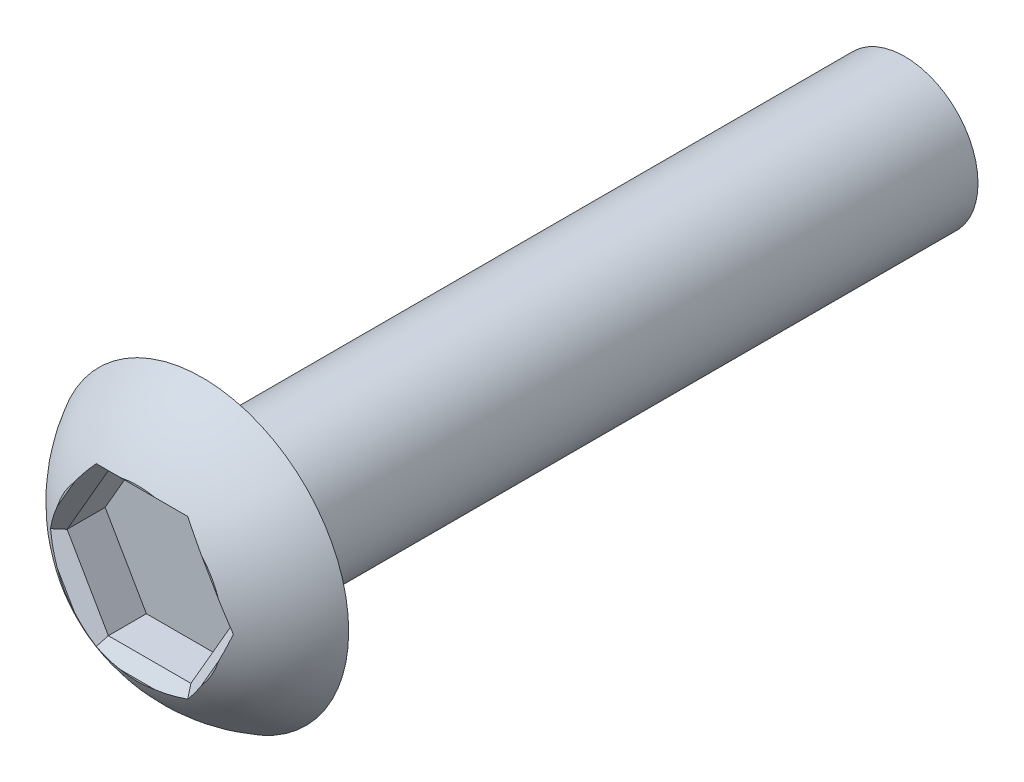
ISO-10303-21;
HEADER;
FILE_DESCRIPTION(('STEP AP214'),'2;1');
FILE_NAME('part.step','',(''),(''),'','','');
FILE_SCHEMA(('AUTOMOTIVE_DESIGN { 1 0 10303 214 1 1 1 1 }'));
ENDSEC;
DATA;
#1=APPLICATION_CONTEXT('core data for automotive mechanical design processes');
#2=APPLICATION_PROTOCOL_DEFINITION('international standard','automotive_design',2000,#1);
#3=PRODUCT_CONTEXT('',#1,'mechanical');
#4=PRODUCT('Part','Part','',(#3));
#5=PRODUCT_RELATED_PRODUCT_CATEGORY('part','',(#4));
#6=PRODUCT_DEFINITION_FORMATION('','',#4);
#7=PRODUCT_DEFINITION_CONTEXT('part definition',#1,'design');
#8=PRODUCT_DEFINITION('design','',#6,#7);
#9=PRODUCT_DEFINITION_SHAPE('','',#8);
#10=(LENGTH_UNIT() NAMED_UNIT(*) SI_UNIT(.MILLI.,.METRE.));
#11=(NAMED_UNIT(*) PLANE_ANGLE_UNIT() SI_UNIT($,.RADIAN.));
#12=(NAMED_UNIT(*) SI_UNIT($,.STERADIAN.) SOLID_ANGLE_UNIT());
#13=UNCERTAINTY_MEASURE_WITH_UNIT(LENGTH_MEASURE(1.E-05),#10,'distance_accuracy_value','');
#14=(GEOMETRIC_REPRESENTATION_CONTEXT(3) GLOBAL_UNCERTAINTY_ASSIGNED_CONTEXT((#13)) GLOBAL_UNIT_ASSIGNED_CONTEXT((#10,
#11,#12)) REPRESENTATION_CONTEXT('',''));
#15=CARTESIAN_POINT('',(0.,0.,0.));
#16=DIRECTION('',(0.,0.,1.));
#17=DIRECTION('',(1.,0.,0.));
#18=AXIS2_PLACEMENT_3D('',#15,#16,#17);
#19=CARTESIAN_POINT('',(-2.5,2.39752736076255,1.1));
#20=DIRECTION('',(0.,0.,-1.));
#21=DIRECTION('',(0.,1.,0.));
#22=AXIS2_PLACEMENT_3D('',#19,#20,#21);
#23=PLANE('',#22);
#24=CARTESIAN_POINT('',(0.,0.,1.1));
#25=DIRECTION('',(0.,0.,-1.));
#26=DIRECTION('',(0.,1.,0.));
#27=AXIS2_PLACEMENT_3D('',#24,#25,#26);
#28=CIRCLE('',#27,1.45143607047182);
#29=CARTESIAN_POINT('',(1.37844449970401,0.454485894063209,1.1));
#30=VERTEX_POINT('',#29);
#31=CARTESIAN_POINT('',(1.08281857977244,0.966525007418985,1.1));
#32=VERTEX_POINT('',#31);
#33=EDGE_CURVE('E298',#30,#32,#28,.F.);
#34=ORIENTED_EDGE('',*,*,#33,.T.);
#35=DIRECTION('',(0.499999999999995,-0.866025403784442,0.));
#36=VECTOR('',#35,1.);
#37=CARTESIAN_POINT('',(1.58310702606532,0.0999999999999997,1.1));
#38=LINE('',#37,#36);
#39=EDGE_CURVE('E216',#32,#30,#38,.T.);
#40=ORIENTED_EDGE('',*,*,#39,.T.);
#41=EDGE_LOOP('',(#34,#40));
#42=FACE_BOUND('',#41,.T.);
#43=ADVANCED_FACE('F43',(#42),#23,.F.);
#44=CARTESIAN_POINT('',(1.08281857977242,-0.966525007419008,1.1));
#45=VERTEX_POINT('',#44);
#46=CARTESIAN_POINT('',(1.37844449970401,-0.454485894063198,1.1));
#47=VERTEX_POINT('',#46);
#48=EDGE_CURVE('E305',#45,#47,#28,.F.);
#49=ORIENTED_EDGE('',*,*,#48,.T.);
#50=DIRECTION('',(-0.500000000000001,-0.866025403784438,0.));
#51=VECTOR('',#50,1.);
#52=CARTESIAN_POINT('',(0.878156053411103,-1.3210109014822,1.1));
#53=LINE('',#52,#51);
#54=EDGE_CURVE('E213',#47,#45,#53,.T.);
#55=ORIENTED_EDGE('',*,*,#54,.T.);
#56=EDGE_LOOP('',(#49,#55));
#57=FACE_BOUND('',#56,.T.);
#58=ADVANCED_FACE('F328',(#57),#23,.F.);
#59=CARTESIAN_POINT('',(-0.295625919931604,-1.4210109014822,1.1));
#60=VERTEX_POINT('',#59);
#61=CARTESIAN_POINT('',(0.295625919931595,-1.4210109014822,1.1));
#62=VERTEX_POINT('',#61);
#63=EDGE_CURVE('E314',#60,#62,#28,.F.);
#64=ORIENTED_EDGE('',*,*,#63,.T.);
#65=DIRECTION('',(-1.,0.,0.));
#66=VECTOR('',#65,1.);
#67=CARTESIAN_POINT('',(-0.704950972654223,-1.4210109014822,1.1));
#68=LINE('',#67,#66);
#69=EDGE_CURVE('E210',#62,#60,#68,.T.);
#70=ORIENTED_EDGE('',*,*,#69,.T.);
#71=EDGE_LOOP('',(#64,#70));
#72=FACE_BOUND('',#71,.T.);
#73=ADVANCED_FACE('F341',(#72),#23,.F.);
#74=CARTESIAN_POINT('',(-1.37844449970402,-0.454485894063183,1.1));
#75=VERTEX_POINT('',#74);
#76=CARTESIAN_POINT('',(-1.08281857977242,-0.966525007419005,1.1));
#77=VERTEX_POINT('',#76);
#78=EDGE_CURVE('E308',#75,#77,#28,.F.);
#79=ORIENTED_EDGE('',*,*,#78,.T.);
#80=DIRECTION('',(-0.499999999999995,0.866025403784442,0.));
#81=VECTOR('',#80,1.);
#82=CARTESIAN_POINT('',(-1.58310702606532,-0.0999999999999897,1.1));
#83=LINE('',#82,#81);
#84=EDGE_CURVE('E207',#77,#75,#83,.T.);
#85=ORIENTED_EDGE('',*,*,#84,.T.);
#86=EDGE_LOOP('',(#79,#85));
#87=FACE_BOUND('',#86,.T.);
#88=ADVANCED_FACE('F346',(#87),#23,.F.);
#89=CARTESIAN_POINT('',(0.295625919931614,1.4210109014822,1.1));
#90=VERTEX_POINT('',#89);
#91=CARTESIAN_POINT('',(-0.295625919931585,1.42101090148221,1.1));
#92=VERTEX_POINT('',#91);
#93=EDGE_CURVE('E292',#90,#92,#28,.F.);
#94=ORIENTED_EDGE('',*,*,#93,.T.);
#95=DIRECTION('',(1.,0.,0.));
#96=VECTOR('',#95,1.);
#97=CARTESIAN_POINT('',(0.704950972654233,1.42101090148219,1.1));
#98=LINE('',#97,#96);
#99=EDGE_CURVE('E204',#92,#90,#98,.T.);
#100=ORIENTED_EDGE('',*,*,#99,.T.);
#101=EDGE_LOOP('',(#94,#100));
#102=FACE_BOUND('',#101,.T.);
#103=ADVANCED_FACE('F356',(#102),#23,.F.);
#104=CARTESIAN_POINT('',(0.,0.,-1.33333333333333));
#105=DIRECTION('',(0.,0.,1.));
#106=DIRECTION('',(0.,-1.,0.));
#107=AXIS2_PLACEMENT_3D('',#104,#105,#106);
#108=SPHERICAL_SURFACE('',#107,2.83333333333333);
#109=ORIENTED_EDGE('',*,*,#33,.F.);
#110=CARTESIAN_POINT('',(-0.438348471401958,-0.253080607962778,-0.827172117407775));
#111=DIRECTION('',(-0.612372435695798,-0.353553390593271,0.707106781186546));
#112=DIRECTION('',(0.755928946018452,0.,0.65465367070798));
#113=AXIS2_PLACEMENT_3D('',#110,#111,#112);
#114=CIRCLE('',#113,2.74141923549889);
#115=CARTESIAN_POINT('',(1.56123159166266,0.,1.03105531808848));
#116=VERTEX_POINT('',#115);
#117=EDGE_CURVE('E253',#30,#116,#114,.F.);
#118=ORIENTED_EDGE('',*,*,#117,.T.);
#119=CARTESIAN_POINT('',(-0.438348471401959,0.253080607962783,-0.82717211740777));
#120=DIRECTION('',(-0.612372435695795,0.353553390593275,0.707106781186547));
#121=DIRECTION('',(0.755928946018454,0.,0.654653670707977));
#122=AXIS2_PLACEMENT_3D('',#119,#120,#121);
#123=CIRCLE('',#122,2.74141923549888);
#124=EDGE_CURVE('E250',#116,#47,#123,.F.);
#125=ORIENTED_EDGE('',*,*,#124,.T.);
#126=ORIENTED_EDGE('',*,*,#48,.F.);
#127=CARTESIAN_POINT('',(-0.438348471401959,0.253080607962783,-0.82717211740777));
#128=DIRECTION('',(-0.612372435695795,0.353553390593275,0.707106781186547));
#129=DIRECTION('',(0.755928946018454,0.,0.654653670707977));
#130=AXIS2_PLACEMENT_3D('',#127,#128,#129);
#131=CIRCLE('',#130,2.74141923549888);
#132=CARTESIAN_POINT('',(0.78061579583133,-1.35206621957068,1.03105531808848));
#133=VERTEX_POINT('',#132);
#134=EDGE_CURVE('E247',#45,#133,#131,.F.);
#135=ORIENTED_EDGE('',*,*,#134,.T.);
#136=CARTESIAN_POINT('',(0.,0.506161215925563,-0.827172117407775));
#137=DIRECTION('',(0.,0.707106781186549,0.707106781186546));
#138=DIRECTION('',(0.,-0.707106781186546,0.707106781186549));
#139=AXIS2_PLACEMENT_3D('',#136,#137,#138);
#140=CIRCLE('',#139,2.74141923549889);
#141=EDGE_CURVE('E244',#133,#62,#140,.F.);
#142=ORIENTED_EDGE('',*,*,#141,.T.);
#143=ORIENTED_EDGE('',*,*,#63,.F.);
#144=CARTESIAN_POINT('',(0.,0.506161215925563,-0.827172117407775));
#145=DIRECTION('',(0.,0.707106781186549,0.707106781186546));
#146=DIRECTION('',(0.,-0.707106781186546,0.707106781186549));
#147=AXIS2_PLACEMENT_3D('',#144,#145,#146);
#148=CIRCLE('',#147,2.74141923549889);
#149=CARTESIAN_POINT('',(-0.780615795831337,-1.35206621957068,1.03105531808848));
#150=VERTEX_POINT('',#149);
#151=EDGE_CURVE('E241',#60,#150,#148,.F.);
#152=ORIENTED_EDGE('',*,*,#151,.T.);
#153=CARTESIAN_POINT('',(0.43834847140196,0.253080607962779,-0.827172117407774));
#154=DIRECTION('',(0.612372435695798,0.353553390593271,0.707106781186546));
#155=DIRECTION('',(0.755928946018452,0.,-0.65465367070798));
#156=AXIS2_PLACEMENT_3D('',#153,#154,#155);
#157=CIRCLE('',#156,2.74141923549889);
#158=EDGE_CURVE('E238',#150,#77,#157,.F.);
#159=ORIENTED_EDGE('',*,*,#158,.T.);
#160=ORIENTED_EDGE('',*,*,#78,.F.);
#161=CARTESIAN_POINT('',(0.43834847140196,0.253080607962779,-0.827172117407774));
#162=DIRECTION('',(0.612372435695798,0.353553390593271,0.707106781186546));
#163=DIRECTION('',(0.755928946018452,0.,-0.65465367070798));
#164=AXIS2_PLACEMENT_3D('',#161,#162,#163);
#165=CIRCLE('',#164,2.74141923549889);
#166=CARTESIAN_POINT('',(-1.56123159166266,0.,1.03105531808848));
#167=VERTEX_POINT('',#166);
#168=EDGE_CURVE('E223',#75,#167,#165,.F.);
#169=ORIENTED_EDGE('',*,*,#168,.T.);
#170=CARTESIAN_POINT('',(0.438348471401956,-0.253080607962785,-0.827172117407773));
#171=DIRECTION('',(0.612372435695793,-0.353553390593279,0.707106781186546));
#172=DIRECTION('',(0.755928946018455,0.,-0.654653670707977));
#173=AXIS2_PLACEMENT_3D('',#170,#171,#172);
#174=CIRCLE('',#173,2.74141923549889);
#175=CARTESIAN_POINT('',(-1.37844449970401,0.454485894063204,1.1));
#176=VERTEX_POINT('',#175);
#177=EDGE_CURVE('E220',#167,#176,#174,.F.);
#178=ORIENTED_EDGE('',*,*,#177,.T.);
#179=CARTESIAN_POINT('',(-1.08281857977241,0.966525007419018,1.1));
#180=VERTEX_POINT('',#179);
#181=EDGE_CURVE('E176',#180,#176,#28,.F.);
#182=ORIENTED_EDGE('',*,*,#181,.F.);
#183=CARTESIAN_POINT('',(0.438348471401956,-0.253080607962785,-0.827172117407773));
#184=DIRECTION('',(0.612372435695793,-0.353553390593279,0.707106781186546));
#185=DIRECTION('',(0.755928946018455,0.,-0.654653670707977));
#186=AXIS2_PLACEMENT_3D('',#183,#184,#185);
#187=CIRCLE('',#186,2.74141923549889);
#188=CARTESIAN_POINT('',(-0.780615795831319,1.35206621957069,1.03105531808848));
#189=VERTEX_POINT('',#188);
#190=EDGE_CURVE('E226',#180,#189,#187,.F.);
#191=ORIENTED_EDGE('',*,*,#190,.T.);
#192=CARTESIAN_POINT('',(0.,-0.506161215925562,-0.827172117407774));
#193=DIRECTION('',(0.,-0.707106781186549,0.707106781186546));
#194=DIRECTION('',(0.,-0.707106781186546,-0.707106781186549));
#195=AXIS2_PLACEMENT_3D('',#192,#193,#194);
#196=CIRCLE('',#195,2.74141923549889);
#197=EDGE_CURVE('E229',#189,#92,#196,.F.);
#198=ORIENTED_EDGE('',*,*,#197,.T.);
#199=ORIENTED_EDGE('',*,*,#93,.F.);
#200=CARTESIAN_POINT('',(0.,-0.506161215925562,-0.827172117407774));
#201=DIRECTION('',(0.,-0.707106781186549,0.707106781186546));
#202=DIRECTION('',(0.,-0.707106781186546,-0.707106781186549));
#203=AXIS2_PLACEMENT_3D('',#200,#201,#202);
#204=CIRCLE('',#203,2.74141923549889);
#205=CARTESIAN_POINT('',(0.780615795831347,1.35206621957067,1.03105531808848));
#206=VERTEX_POINT('',#205);
#207=EDGE_CURVE('E232',#90,#206,#204,.F.);
#208=ORIENTED_EDGE('',*,*,#207,.T.);
#209=CARTESIAN_POINT('',(-0.438348471401958,-0.253080607962778,-0.827172117407775));
#210=DIRECTION('',(-0.612372435695798,-0.353553390593271,0.707106781186546));
#211=DIRECTION('',(0.755928946018452,0.,0.65465367070798));
#212=AXIS2_PLACEMENT_3D('',#209,#210,#211);
#213=CIRCLE('',#212,2.74141923549889);
#214=EDGE_CURVE('E235',#206,#32,#213,.F.);
#215=ORIENTED_EDGE('',*,*,#214,.T.);
#216=EDGE_LOOP('',(#109,#118,#125,#126,#135,#142,#143,#152,#159,#160,#169,#178,#182,#191,#198,
#199,#208,#215));
#217=FACE_BOUND('',#216,.T.);
#218=CARTESIAN_POINT('',(0.,0.,0.));
#219=DIRECTION('',(0.,0.,1.));
#220=DIRECTION('',(1.,0.,0.));
#221=AXIS2_PLACEMENT_3D('',#218,#219,#220);
#222=CIRCLE('',#221,2.5);
#223=CARTESIAN_POINT('',(2.5,0.,0.));
#224=VERTEX_POINT('',#223);
#225=EDGE_CURVE('E182',#224,#224,#222,.T.);
#226=ORIENTED_EDGE('',*,*,#225,.T.);
#227=EDGE_LOOP('',(#226));
#228=FACE_BOUND('',#227,.T.);
#229=ADVANCED_FACE('F338',(#217,#228),#108,.T.);
#230=CARTESIAN_POINT('',(0.,0.,-12.));
#231=DIRECTION('',(0.,0.,1.));
#232=DIRECTION('',(1.,0.,0.));
#233=AXIS2_PLACEMENT_3D('',#230,#231,#232);
#234=CYLINDRICAL_SURFACE('',#233,1.25);
#235=CARTESIAN_POINT('',(0.,0.,-12.));
#236=DIRECTION('',(0.,0.,1.));
#237=DIRECTION('',(1.,0.,0.));
#238=AXIS2_PLACEMENT_3D('',#235,#236,#237);
#239=CIRCLE('',#238,1.25);
#240=CARTESIAN_POINT('',(1.25,0.,-12.));
#241=VERTEX_POINT('',#240);
#242=EDGE_CURVE('E194',#241,#241,#239,.T.);
#243=ORIENTED_EDGE('',*,*,#242,.T.);
#244=EDGE_LOOP('',(#243));
#245=FACE_BOUND('',#244,.T.);
#246=CARTESIAN_POINT('',(0.,0.,0.));
#247=DIRECTION('',(0.,0.,1.));
#248=DIRECTION('',(1.,0.,0.));
#249=AXIS2_PLACEMENT_3D('',#246,#247,#248);
#250=CIRCLE('',#249,1.25);
#251=CARTESIAN_POINT('',(1.25,0.,0.));
#252=VERTEX_POINT('',#251);
#253=EDGE_CURVE('E188',#252,#252,#250,.T.);
#254=ORIENTED_EDGE('',*,*,#253,.F.);
#255=EDGE_LOOP('',(#254));
#256=FACE_BOUND('',#255,.T.);
#257=ADVANCED_FACE('F383',(#245,#256),#234,.T.);
#258=CARTESIAN_POINT('',(0.,0.,-12.));
#259=DIRECTION('',(0.,0.,1.));
#260=DIRECTION('',(1.,0.,0.));
#261=AXIS2_PLACEMENT_3D('',#258,#259,#260);
#262=PLANE('',#261);
#263=ORIENTED_EDGE('',*,*,#242,.F.);
#264=EDGE_LOOP('',(#263));
#265=FACE_BOUND('',#264,.T.);
#266=ADVANCED_FACE('F375',(#265),#262,.F.);
#267=CARTESIAN_POINT('',(0.,0.,0.));
#268=DIRECTION('',(0.,0.,1.));
#269=DIRECTION('',(1.,0.,0.));
#270=AXIS2_PLACEMENT_3D('',#267,#268,#269);
#271=PLANE('',#270);
#272=ORIENTED_EDGE('',*,*,#253,.T.);
#273=EDGE_LOOP('',(#272));
#274=FACE_BOUND('',#273,.T.);
#275=ORIENTED_EDGE('',*,*,#225,.F.);
#276=EDGE_LOOP('',(#275));
#277=FACE_BOUND('',#276,.T.);
#278=ADVANCED_FACE('F369',(#274,#277),#271,.F.);
#279=ORIENTED_EDGE('',*,*,#181,.T.);
#280=DIRECTION('',(0.500000000000007,0.866025403784435,0.));
#281=VECTOR('',#280,1.);
#282=CARTESIAN_POINT('',(-0.878156053411094,1.32101090148221,1.1));
#283=LINE('',#282,#281);
#284=EDGE_CURVE('E198',#176,#180,#283,.T.);
#285=ORIENTED_EDGE('',*,*,#284,.T.);
#286=EDGE_LOOP('',(#279,#285));
#287=FACE_BOUND('',#286,.T.);
#288=ADVANCED_FACE('F350',(#287),#23,.F.);
#289=CARTESIAN_POINT('',(0.,0.,0.25));
#290=DIRECTION('',(0.,0.,-1.));
#291=DIRECTION('',(-1.,0.,0.));
#292=AXIS2_PLACEMENT_3D('',#289,#290,#291);
#293=PLANE('',#292);
#294=DIRECTION('',(0.499999999999995,-0.866025403784441,0.));
#295=VECTOR('',#294,1.);
#296=CARTESIAN_POINT('',(0.704950972654231,1.22101090148219,0.25));
#297=LINE('',#296,#295);
#298=CARTESIAN_POINT('',(0.704950972654231,1.22101090148219,0.25));
#299=VERTEX_POINT('',#298);
#300=CARTESIAN_POINT('',(1.40990194530843,0.,0.25));
#301=VERTEX_POINT('',#300);
#302=EDGE_CURVE('E158',#299,#301,#297,.T.);
#303=ORIENTED_EDGE('',*,*,#302,.F.);
#304=DIRECTION('',(1.,0.,0.));
#305=VECTOR('',#304,1.);
#306=CARTESIAN_POINT('',(-0.704950972654205,1.22101090148221,0.25));
#307=LINE('',#306,#305);
#308=CARTESIAN_POINT('',(-0.704950972654205,1.22101090148221,0.25));
#309=VERTEX_POINT('',#308);
#310=EDGE_CURVE('E572',#309,#299,#307,.T.);
#311=ORIENTED_EDGE('',*,*,#310,.F.);
#312=DIRECTION('',(0.500000000000007,0.866025403784434,0.));
#313=VECTOR('',#312,1.);
#314=CARTESIAN_POINT('',(-1.40990194530843,0.,0.25));
#315=LINE('',#314,#313);
#316=CARTESIAN_POINT('',(-1.40990194530843,0.,0.25));
#317=VERTEX_POINT('',#316);
#318=EDGE_CURVE('E575',#317,#309,#315,.T.);
#319=ORIENTED_EDGE('',*,*,#318,.F.);
#320=DIRECTION('',(-0.499999999999995,0.866025403784442,0.));
#321=VECTOR('',#320,1.);
#322=CARTESIAN_POINT('',(-0.704950972654223,-1.2210109014822,0.25));
#323=LINE('',#322,#321);
#324=CARTESIAN_POINT('',(-0.704950972654223,-1.2210109014822,0.25));
#325=VERTEX_POINT('',#324);
#326=EDGE_CURVE('E578',#325,#317,#323,.T.);
#327=ORIENTED_EDGE('',*,*,#326,.F.);
#328=DIRECTION('',(-1.,0.,0.));
#329=VECTOR('',#328,1.);
#330=CARTESIAN_POINT('',(0.704950972654214,-1.2210109014822,0.25));
#331=LINE('',#330,#329);
#332=CARTESIAN_POINT('',(0.704950972654214,-1.2210109014822,0.25));
#333=VERTEX_POINT('',#332);
#334=EDGE_CURVE('E160',#333,#325,#331,.T.);
#335=ORIENTED_EDGE('',*,*,#334,.F.);
#336=DIRECTION('',(-0.500000000000001,-0.866025403784438,0.));
#337=VECTOR('',#336,1.);
#338=CARTESIAN_POINT('',(1.40990194530843,0.,0.25));
#339=LINE('',#338,#337);
#340=EDGE_CURVE('E154',#301,#333,#339,.T.);
#341=ORIENTED_EDGE('',*,*,#340,.F.);
#342=EDGE_LOOP('',(#303,#311,#319,#327,#335,#341));
#343=FACE_BOUND('',#342,.T.);
#344=ADVANCED_FACE('F156',(#343),#293,.F.);
#345=CARTESIAN_POINT('',(-0.704950972654205,1.22101090148221,0.25));
#346=DIRECTION('',(0.,-1.,0.));
#347=DIRECTION('',(1.,0.,0.));
#348=AXIS2_PLACEMENT_3D('',#345,#346,#347);
#349=PLANE('',#348);
#350=DIRECTION('',(0.,0.,1.));
#351=VECTOR('',#350,1.);
#352=CARTESIAN_POINT('',(0.704950972654231,1.22101090148219,0.25));
#353=LINE('',#352,#351);
#354=CARTESIAN_POINT('',(0.704950972654231,1.22101090148219,0.899999999999998));
#355=VERTEX_POINT('',#354);
#356=EDGE_CURVE('E174',#299,#355,#353,.T.);
#357=ORIENTED_EDGE('',*,*,#356,.T.);
#358=DIRECTION('',(-1.,0.,0.));
#359=VECTOR('',#358,1.);
#360=CARTESIAN_POINT('',(-0.704950972654205,1.22101090148221,0.899999999999998));
#361=LINE('',#360,#359);
#362=CARTESIAN_POINT('',(-0.704950972654205,1.22101090148221,0.899999999999998));
#363=VERTEX_POINT('',#362);
#364=EDGE_CURVE('E54',#355,#363,#361,.T.);
#365=ORIENTED_EDGE('',*,*,#364,.T.);
#366=DIRECTION('',(0.,0.,1.));
#367=VECTOR('',#366,1.);
#368=CARTESIAN_POINT('',(-0.704950972654205,1.22101090148221,0.25));
#369=LINE('',#368,#367);
#370=EDGE_CURVE('E565',#309,#363,#369,.T.);
#371=ORIENTED_EDGE('',*,*,#370,.F.);
#372=ORIENTED_EDGE('',*,*,#310,.T.);
#373=EDGE_LOOP('',(#357,#365,#371,#372));
#374=FACE_BOUND('',#373,.T.);
#375=ADVANCED_FACE('F374',(#374),#349,.T.);
#376=CARTESIAN_POINT('',(-1.40990194530843,0.,0.25));
#377=DIRECTION('',(0.866025403784435,-0.500000000000007,0.));
#378=DIRECTION('',(0.500000000000007,0.866025403784435,0.));
#379=AXIS2_PLACEMENT_3D('',#376,#377,#378);
#380=PLANE('',#379);
#381=ORIENTED_EDGE('',*,*,#370,.T.);
#382=DIRECTION('',(-0.500000000000007,-0.866025403784435,0.));
#383=VECTOR('',#382,1.);
#384=CARTESIAN_POINT('',(-1.40990194530843,0.,0.899999999999998));
#385=LINE('',#384,#383);
#386=CARTESIAN_POINT('',(-1.40990194530843,0.,0.899999999999998));
#387=VERTEX_POINT('',#386);
#388=EDGE_CURVE('E11',#363,#387,#385,.T.);
#389=ORIENTED_EDGE('',*,*,#388,.T.);
#390=DIRECTION('',(0.,0.,1.));
#391=VECTOR('',#390,1.);
#392=CARTESIAN_POINT('',(-1.40990194530843,0.,0.25));
#393=LINE('',#392,#391);
#394=EDGE_CURVE('E563',#317,#387,#393,.T.);
#395=ORIENTED_EDGE('',*,*,#394,.F.);
#396=ORIENTED_EDGE('',*,*,#318,.T.);
#397=EDGE_LOOP('',(#381,#389,#395,#396));
#398=FACE_BOUND('',#397,.T.);
#399=ADVANCED_FACE('F451',(#398),#380,.T.);
#400=CARTESIAN_POINT('',(-0.704950972654223,-1.2210109014822,0.25));
#401=DIRECTION('',(0.866025403784442,0.499999999999995,0.));
#402=DIRECTION('',(-0.499999999999995,0.866025403784442,0.));
#403=AXIS2_PLACEMENT_3D('',#400,#401,#402);
#404=PLANE('',#403);
#405=ORIENTED_EDGE('',*,*,#394,.T.);
#406=DIRECTION('',(0.499999999999995,-0.866025403784442,0.));
#407=VECTOR('',#406,1.);
#408=CARTESIAN_POINT('',(-0.704950972654223,-1.2210109014822,0.899999999999998));
#409=LINE('',#408,#407);
#410=CARTESIAN_POINT('',(-0.704950972654223,-1.2210109014822,0.899999999999998));
#411=VERTEX_POINT('',#410);
#412=EDGE_CURVE('E264',#387,#411,#409,.T.);
#413=ORIENTED_EDGE('',*,*,#412,.T.);
#414=DIRECTION('',(0.,0.,1.));
#415=VECTOR('',#414,1.);
#416=CARTESIAN_POINT('',(-0.704950972654223,-1.2210109014822,0.25));
#417=LINE('',#416,#415);
#418=EDGE_CURVE('E190',#325,#411,#417,.T.);
#419=ORIENTED_EDGE('',*,*,#418,.F.);
#420=ORIENTED_EDGE('',*,*,#326,.T.);
#421=EDGE_LOOP('',(#405,#413,#419,#420));
#422=FACE_BOUND('',#421,.T.);
#423=ADVANCED_FACE('F460',(#422),#404,.T.);
#424=CARTESIAN_POINT('',(0.704950972654214,-1.2210109014822,0.25));
#425=DIRECTION('',(0.,1.,0.));
#426=DIRECTION('',(-1.,0.,0.));
#427=AXIS2_PLACEMENT_3D('',#424,#425,#426);
#428=PLANE('',#427);
#429=ORIENTED_EDGE('',*,*,#418,.T.);
#430=DIRECTION('',(1.,0.,0.));
#431=VECTOR('',#430,1.);
#432=CARTESIAN_POINT('',(0.704950972654214,-1.2210109014822,0.899999999999998));
#433=LINE('',#432,#431);
#434=CARTESIAN_POINT('',(0.704950972654214,-1.2210109014822,0.899999999999998));
#435=VERTEX_POINT('',#434);
#436=EDGE_CURVE('E261',#411,#435,#433,.T.);
#437=ORIENTED_EDGE('',*,*,#436,.T.);
#438=DIRECTION('',(0.,0.,1.));
#439=VECTOR('',#438,1.);
#440=CARTESIAN_POINT('',(0.704950972654214,-1.2210109014822,0.25));
#441=LINE('',#440,#439);
#442=EDGE_CURVE('E183',#333,#435,#441,.T.);
#443=ORIENTED_EDGE('',*,*,#442,.F.);
#444=ORIENTED_EDGE('',*,*,#334,.T.);
#445=EDGE_LOOP('',(#429,#437,#443,#444));
#446=FACE_BOUND('',#445,.T.);
#447=ADVANCED_FACE('F469',(#446),#428,.T.);
#448=CARTESIAN_POINT('',(1.40990194530843,0.,0.25));
#449=DIRECTION('',(-0.866025403784438,0.500000000000001,0.));
#450=DIRECTION('',(-0.500000000000001,-0.866025403784438,0.));
#451=AXIS2_PLACEMENT_3D('',#448,#449,#450);
#452=PLANE('',#451);
#453=ORIENTED_EDGE('',*,*,#442,.T.);
#454=DIRECTION('',(0.500000000000001,0.866025403784438,0.));
#455=VECTOR('',#454,1.);
#456=CARTESIAN_POINT('',(1.40990194530843,0.,0.899999999999998));
#457=LINE('',#456,#455);
#458=CARTESIAN_POINT('',(1.40990194530843,0.,0.899999999999998));
#459=VERTEX_POINT('',#458);
#460=EDGE_CURVE('E180',#435,#459,#457,.T.);
#461=ORIENTED_EDGE('',*,*,#460,.T.);
#462=DIRECTION('',(0.,0.,1.));
#463=VECTOR('',#462,1.);
#464=CARTESIAN_POINT('',(1.40990194530843,0.,0.25));
#465=LINE('',#464,#463);
#466=EDGE_CURVE('E172',#301,#459,#465,.T.);
#467=ORIENTED_EDGE('',*,*,#466,.F.);
#468=ORIENTED_EDGE('',*,*,#340,.T.);
#469=EDGE_LOOP('',(#453,#461,#467,#468));
#470=FACE_BOUND('',#469,.T.);
#471=ADVANCED_FACE('F178',(#470),#452,.T.);
#472=CARTESIAN_POINT('',(0.704950972654231,1.22101090148219,0.25));
#473=DIRECTION('',(-0.866025403784442,-0.499999999999995,0.));
#474=DIRECTION('',(0.499999999999995,-0.866025403784442,0.));
#475=AXIS2_PLACEMENT_3D('',#472,#473,#474);
#476=PLANE('',#475);
#477=ORIENTED_EDGE('',*,*,#466,.T.);
#478=DIRECTION('',(-0.499999999999995,0.866025403784442,0.));
#479=VECTOR('',#478,1.);
#480=CARTESIAN_POINT('',(0.704950972654231,1.22101090148219,0.899999999999998));
#481=LINE('',#480,#479);
#482=EDGE_CURVE('E256',#459,#355,#481,.T.);
#483=ORIENTED_EDGE('',*,*,#482,.T.);
#484=ORIENTED_EDGE('',*,*,#356,.F.);
#485=ORIENTED_EDGE('',*,*,#302,.T.);
#486=EDGE_LOOP('',(#477,#483,#484,#485));
#487=FACE_BOUND('',#486,.T.);
#488=ADVANCED_FACE('F170',(#487),#476,.T.);
#489=CARTESIAN_POINT('',(-2.89379134008251,2.17017182456137,1.1));
#490=DIRECTION('',(0.612372435695798,0.353553390593271,0.707106781186546));
#491=DIRECTION('',(0.499999999999995,-0.866025403784442,0.));
#492=AXIS2_PLACEMENT_3D('',#489,#490,#491);
#493=PLANE('',#492);
#494=DIRECTION('',(-0.37796447300923,-0.654653670707974,0.654653670707979));
#495=VECTOR('',#494,1.);
#496=CARTESIAN_POINT('',(-0.228029508323463,-0.394958694041187,0.0739477925589802));
#497=LINE('',#496,#495);
#498=EDGE_CURVE('E283',#411,#150,#497,.T.);
#499=ORIENTED_EDGE('',*,*,#498,.F.);
#500=ORIENTED_EDGE('',*,*,#412,.F.);
#501=DIRECTION('',(-0.755928946018453,0.,0.654653670707978));
#502=VECTOR('',#501,1.);
#503=CARTESIAN_POINT('',(-1.17034473093264,0.,0.692537366690729));
#504=LINE('',#503,#502);
#505=EDGE_CURVE('E48',#167,#387,#504,.F.);
#506=ORIENTED_EDGE('',*,*,#505,.F.);
#507=ORIENTED_EDGE('',*,*,#168,.F.);
#508=ORIENTED_EDGE('',*,*,#84,.F.);
#509=ORIENTED_EDGE('',*,*,#158,.F.);
#510=EDGE_LOOP('',(#499,#500,#506,#507,#508,#509));
#511=FACE_BOUND('',#510,.T.);
#512=ADVANCED_FACE('F46',(#511),#493,.T.);
#513=CARTESIAN_POINT('',(-0.817471739393901,1.42611921658245,1.1));
#514=DIRECTION('',(0.612372435695793,-0.353553390593279,0.707106781186546));
#515=DIRECTION('',(-0.500000000000007,-0.866025403784435,0.));
#516=AXIS2_PLACEMENT_3D('',#513,#514,#515);
#517=PLANE('',#516);
#518=ORIENTED_EDGE('',*,*,#505,.T.);
#519=ORIENTED_EDGE('',*,*,#388,.F.);
#520=DIRECTION('',(0.377964473009221,-0.654653670707979,-0.654653670707979));
#521=VECTOR('',#520,1.);
#522=CARTESIAN_POINT('',(-0.821263679948767,1.42247042008228,1.10145951860007));
#523=LINE('',#522,#521);
#524=EDGE_CURVE('E280',#189,#363,#523,.T.);
#525=ORIENTED_EDGE('',*,*,#524,.F.);
#526=ORIENTED_EDGE('',*,*,#190,.F.);
#527=ORIENTED_EDGE('',*,*,#284,.F.);
#528=ORIENTED_EDGE('',*,*,#177,.F.);
#529=EDGE_LOOP('',(#518,#519,#525,#526,#527,#528));
#530=FACE_BOUND('',#529,.T.);
#531=ADVANCED_FACE('F347',(#530),#517,.T.);
#532=CARTESIAN_POINT('',(-2.50000000000001,-1.42101090148219,1.1));
#533=DIRECTION('',(0.,0.707106781186549,0.707106781186546));
#534=DIRECTION('',(1.,0.,0.));
#535=AXIS2_PLACEMENT_3D('',#532,#533,#534);
#536=PLANE('',#535);
#537=ORIENTED_EDGE('',*,*,#69,.F.);
#538=ORIENTED_EDGE('',*,*,#141,.F.);
#539=DIRECTION('',(0.377964473009228,-0.654653670707976,0.654653670707978));
#540=VECTOR('',#539,1.);
#541=CARTESIAN_POINT('',(0.346075165564687,-0.599419769995855,0.278408868513648));
#542=LINE('',#541,#540);
#543=EDGE_CURVE('E276',#435,#133,#542,.T.);
#544=ORIENTED_EDGE('',*,*,#543,.F.);
#545=ORIENTED_EDGE('',*,*,#436,.F.);
#546=ORIENTED_EDGE('',*,*,#498,.T.);
#547=ORIENTED_EDGE('',*,*,#151,.F.);
#548=EDGE_LOOP('',(#537,#538,#544,#545,#546,#547));
#549=FACE_BOUND('',#548,.T.);
#550=ADVANCED_FACE('F340',(#549),#536,.T.);
#551=CARTESIAN_POINT('',(-2.50000000000001,1.42101090148223,1.1));
#552=DIRECTION('',(0.,-0.707106781186549,0.707106781186546));
#553=DIRECTION('',(-1.,0.,0.));
#554=AXIS2_PLACEMENT_3D('',#551,#552,#553);
#555=PLANE('',#554);
#556=ORIENTED_EDGE('',*,*,#524,.T.);
#557=ORIENTED_EDGE('',*,*,#364,.F.);
#558=DIRECTION('',(-0.377964473009232,-0.654653670707972,-0.654653670707979));
#559=VECTOR('',#558,1.);
#560=CARTESIAN_POINT('',(0.346075165564702,0.599419769995855,0.278408868513652));
#561=LINE('',#560,#559);
#562=EDGE_CURVE('E273',#206,#355,#561,.T.);
#563=ORIENTED_EDGE('',*,*,#562,.F.);
#564=ORIENTED_EDGE('',*,*,#207,.F.);
#565=ORIENTED_EDGE('',*,*,#99,.F.);
#566=ORIENTED_EDGE('',*,*,#197,.F.);
#567=EDGE_LOOP('',(#556,#557,#563,#564,#565,#566));
#568=FACE_BOUND('',#567,.T.);
#569=ADVANCED_FACE('F353',(#568),#555,.T.);
#570=CARTESIAN_POINT('',(1.64379134008253,0.00510831510025988,1.1));
#571=DIRECTION('',(-0.612372435695795,0.353553390593275,0.707106781186547));
#572=DIRECTION('',(0.500000000000001,0.866025403784438,0.));
#573=AXIS2_PLACEMENT_3D('',#570,#571,#572);
#574=PLANE('',#573);
#575=ORIENTED_EDGE('',*,*,#54,.F.);
#576=ORIENTED_EDGE('',*,*,#124,.F.);
#577=DIRECTION('',(0.755928946018453,0.,0.654653670707979));
#578=VECTOR('',#577,1.);
#579=CARTESIAN_POINT('',(1.64252735989757,0.,1.10145951860007));
#580=LINE('',#579,#578);
#581=EDGE_CURVE('E269',#459,#116,#580,.T.);
#582=ORIENTED_EDGE('',*,*,#581,.F.);
#583=ORIENTED_EDGE('',*,*,#460,.F.);
#584=ORIENTED_EDGE('',*,*,#543,.T.);
#585=ORIENTED_EDGE('',*,*,#134,.F.);
#586=EDGE_LOOP('',(#575,#576,#582,#583,#584,#585));
#587=FACE_BOUND('',#586,.T.);
#588=ADVANCED_FACE('F333',(#587),#574,.T.);
#589=CARTESIAN_POINT('',(-0.432528260606073,3.59118272604356,1.1));
#590=DIRECTION('',(-0.612372435695798,-0.353553390593271,0.707106781186546));
#591=DIRECTION('',(-0.499999999999995,0.866025403784442,0.));
#592=AXIS2_PLACEMENT_3D('',#589,#590,#591);
#593=PLANE('',#592);
#594=ORIENTED_EDGE('',*,*,#562,.T.);
#595=ORIENTED_EDGE('',*,*,#482,.F.);
#596=ORIENTED_EDGE('',*,*,#581,.T.);
#597=ORIENTED_EDGE('',*,*,#117,.F.);
#598=ORIENTED_EDGE('',*,*,#39,.F.);
#599=ORIENTED_EDGE('',*,*,#214,.F.);
#600=EDGE_LOOP('',(#594,#595,#596,#597,#598,#599));
#601=FACE_BOUND('',#600,.T.);
#602=ADVANCED_FACE('F360',(#601),#593,.T.);
#603=CLOSED_SHELL('',(#43,#58,#73,#88,#103,#229,#257,#266,#278,#288,#344,#375,#399,#423,#447,
#471,#488,#512,#531,#550,#569,#588,#602));
#604=MANIFOLD_SOLID_BREP('B2',#603);
#605=ADVANCED_BREP_SHAPE_REPRESENTATION('',(#18,#604),#14);
#606=SHAPE_DEFINITION_REPRESENTATION(#9,#605);
ENDSEC;
END-ISO-10303-21;
